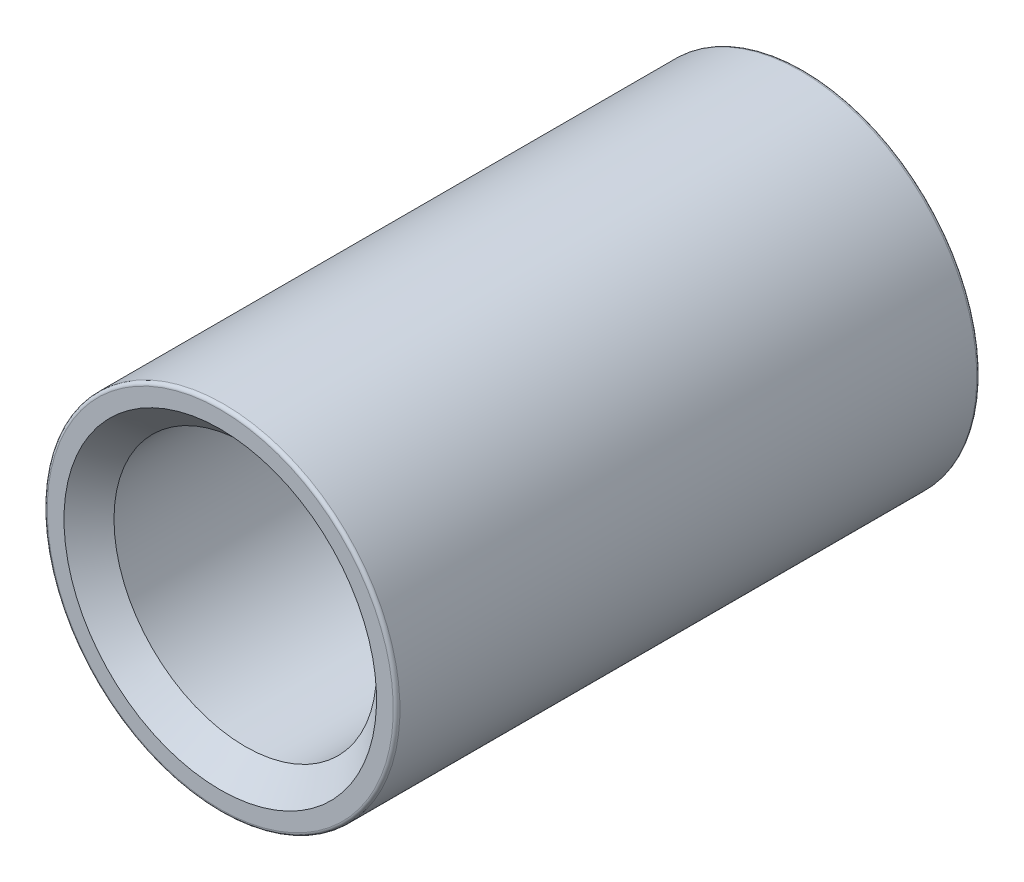
ISO-10303-21;
HEADER;
FILE_DESCRIPTION(('STEP AP214'),'2;1');
FILE_NAME('part.step','',(''),(''),'','','');
FILE_SCHEMA(('AUTOMOTIVE_DESIGN { 1 0 10303 214 1 1 1 1 }'));
ENDSEC;
DATA;
#1=APPLICATION_CONTEXT('core data for automotive mechanical design processes');
#2=APPLICATION_PROTOCOL_DEFINITION('international standard','automotive_design',2000,#1);
#3=PRODUCT_CONTEXT('',#1,'mechanical');
#4=PRODUCT('Part','Part','',(#3));
#5=PRODUCT_RELATED_PRODUCT_CATEGORY('part','',(#4));
#6=PRODUCT_DEFINITION_FORMATION('','',#4);
#7=PRODUCT_DEFINITION_CONTEXT('part definition',#1,'design');
#8=PRODUCT_DEFINITION('design','',#6,#7);
#9=PRODUCT_DEFINITION_SHAPE('','',#8);
#10=(LENGTH_UNIT() NAMED_UNIT(*) SI_UNIT(.MILLI.,.METRE.));
#11=(NAMED_UNIT(*) PLANE_ANGLE_UNIT() SI_UNIT($,.RADIAN.));
#12=(NAMED_UNIT(*) SI_UNIT($,.STERADIAN.) SOLID_ANGLE_UNIT());
#13=UNCERTAINTY_MEASURE_WITH_UNIT(LENGTH_MEASURE(1.E-05),#10,'distance_accuracy_value','');
#14=(GEOMETRIC_REPRESENTATION_CONTEXT(3) GLOBAL_UNCERTAINTY_ASSIGNED_CONTEXT((#13)) GLOBAL_UNIT_ASSIGNED_CONTEXT((#10,
#11,#12)) REPRESENTATION_CONTEXT('',''));
#15=CARTESIAN_POINT('',(0.,0.,0.));
#16=DIRECTION('',(0.,0.,1.));
#17=DIRECTION('',(1.,0.,0.));
#18=AXIS2_PLACEMENT_3D('',#15,#16,#17);
#19=CARTESIAN_POINT('',(0.,0.,-2.505));
#20=DIRECTION('',(0.,0.,-1.));
#21=DIRECTION('',(0.,1.,0.));
#22=AXIS2_PLACEMENT_3D('',#19,#20,#21);
#23=TOROIDAL_SURFACE('',#22,10.3791,0.2);
#24=CARTESIAN_POINT('',(0.,0.,-2.505));
#25=DIRECTION('',(0.,0.,-1.));
#26=DIRECTION('',(0.,1.,0.));
#27=AXIS2_PLACEMENT_3D('',#24,#25,#26);
#28=CIRCLE('',#27,10.5791);
#29=CARTESIAN_POINT('',(0.,10.5791,-2.505));
#30=VERTEX_POINT('',#29);
#31=EDGE_CURVE('E68',#30,#30,#28,.T.);
#32=ORIENTED_EDGE('',*,*,#31,.T.);
#33=EDGE_LOOP('',(#32));
#34=FACE_BOUND('',#33,.T.);
#35=CARTESIAN_POINT('',(0.,0.,-2.705));
#36=DIRECTION('',(0.,0.,-1.));
#37=DIRECTION('',(0.,1.,0.));
#38=AXIS2_PLACEMENT_3D('',#35,#36,#37);
#39=CIRCLE('',#38,10.3791);
#40=CARTESIAN_POINT('',(0.,10.3791,-2.705));
#41=VERTEX_POINT('',#40);
#42=EDGE_CURVE('E10',#41,#41,#39,.T.);
#43=ORIENTED_EDGE('',*,*,#42,.F.);
#44=EDGE_LOOP('',(#43));
#45=FACE_BOUND('',#44,.T.);
#46=ADVANCED_FACE('F37',(#34,#45),#23,.T.);
#47=CARTESIAN_POINT('',(0.,10.3791,-2.705));
#48=DIRECTION('',(0.,0.,-1.));
#49=DIRECTION('',(0.,1.,0.));
#50=AXIS2_PLACEMENT_3D('',#47,#48,#49);
#51=PLANE('',#50);
#52=ORIENTED_EDGE('',*,*,#42,.T.);
#53=EDGE_LOOP('',(#52));
#54=FACE_BOUND('',#53,.T.);
#55=ADVANCED_FACE('F87',(#54),#51,.T.);
#56=CARTESIAN_POINT('',(0.,0.,0.));
#57=DIRECTION('',(0.,0.,1.));
#58=DIRECTION('',(0.,-1.,0.));
#59=AXIS2_PLACEMENT_3D('',#56,#57,#58);
#60=PLANE('',#59);
#61=CARTESIAN_POINT('',(0.,0.,0.));
#62=DIRECTION('',(0.,0.,-1.));
#63=DIRECTION('',(0.,1.,0.));
#64=AXIS2_PLACEMENT_3D('',#61,#62,#63);
#65=CIRCLE('',#64,7.874);
#66=CARTESIAN_POINT('',(0.,7.874,0.));
#67=VERTEX_POINT('',#66);
#68=EDGE_CURVE('E44',#67,#67,#65,.T.);
#69=ORIENTED_EDGE('',*,*,#68,.F.);
#70=EDGE_LOOP('',(#69));
#71=FACE_BOUND('',#70,.T.);
#72=ADVANCED_FACE('F91',(#71),#60,.T.);
#73=CARTESIAN_POINT('',(0.,0.,-2.705));
#74=DIRECTION('',(0.,0.,-1.));
#75=DIRECTION('',(0.,1.,0.));
#76=AXIS2_PLACEMENT_3D('',#73,#74,#75);
#77=CYLINDRICAL_SURFACE('',#76,7.874);
#78=ORIENTED_EDGE('',*,*,#68,.T.);
#79=EDGE_LOOP('',(#78));
#80=FACE_BOUND('',#79,.T.);
#81=CARTESIAN_POINT('',(0.,0.,30.795));
#82=DIRECTION('',(0.,0.,-1.));
#83=DIRECTION('',(0.,1.,0.));
#84=AXIS2_PLACEMENT_3D('',#81,#82,#83);
#85=CIRCLE('',#84,7.87399999999999);
#86=CARTESIAN_POINT('',(0.,7.874,30.795));
#87=VERTEX_POINT('',#86);
#88=EDGE_CURVE('E49',#87,#87,#85,.T.);
#89=ORIENTED_EDGE('',*,*,#88,.F.);
#90=EDGE_LOOP('',(#89));
#91=FACE_BOUND('',#90,.T.);
#92=ADVANCED_FACE('F95',(#80,#91),#77,.F.);
#93=CARTESIAN_POINT('',(0.,0.,32.295));
#94=DIRECTION('',(0.,0.,1.));
#95=DIRECTION('',(0.,-1.,0.));
#96=AXIS2_PLACEMENT_3D('',#93,#94,#95);
#97=CONICAL_SURFACE('',#96,9.37399999999999,0.785398163397448);
#98=ORIENTED_EDGE('',*,*,#88,.T.);
#99=EDGE_LOOP('',(#98));
#100=FACE_BOUND('',#99,.T.);
#101=CARTESIAN_POINT('',(0.,0.,32.295));
#102=DIRECTION('',(0.,0.,-1.));
#103=DIRECTION('',(0.,1.,0.));
#104=AXIS2_PLACEMENT_3D('',#101,#102,#103);
#105=CIRCLE('',#104,9.37399999999999);
#106=CARTESIAN_POINT('',(0.,9.374,32.295));
#107=VERTEX_POINT('',#106);
#108=EDGE_CURVE('E54',#107,#107,#105,.T.);
#109=ORIENTED_EDGE('',*,*,#108,.F.);
#110=EDGE_LOOP('',(#109));
#111=FACE_BOUND('',#110,.T.);
#112=ADVANCED_FACE('F101',(#100,#111),#97,.F.);
#113=CARTESIAN_POINT('',(0.,9.374,32.295));
#114=DIRECTION('',(0.,0.,1.));
#115=DIRECTION('',(0.,-1.,0.));
#116=AXIS2_PLACEMENT_3D('',#113,#114,#115);
#117=PLANE('',#116);
#118=ORIENTED_EDGE('',*,*,#108,.T.);
#119=EDGE_LOOP('',(#118));
#120=FACE_BOUND('',#119,.T.);
#121=CARTESIAN_POINT('',(0.,0.,32.295));
#122=DIRECTION('',(0.,0.,-1.));
#123=DIRECTION('',(0.,1.,0.));
#124=AXIS2_PLACEMENT_3D('',#121,#122,#123);
#125=CIRCLE('',#124,10.3791);
#126=CARTESIAN_POINT('',(0.,10.3791,32.295));
#127=VERTEX_POINT('',#126);
#128=EDGE_CURVE('E60',#127,#127,#125,.T.);
#129=ORIENTED_EDGE('',*,*,#128,.F.);
#130=EDGE_LOOP('',(#129));
#131=FACE_BOUND('',#130,.T.);
#132=ADVANCED_FACE('F83',(#120,#131),#117,.T.);
#133=CARTESIAN_POINT('',(0.,0.,32.095));
#134=DIRECTION('',(0.,0.,-1.));
#135=DIRECTION('',(0.,1.,0.));
#136=AXIS2_PLACEMENT_3D('',#133,#134,#135);
#137=TOROIDAL_SURFACE('',#136,10.3791,0.200000000000001);
#138=ORIENTED_EDGE('',*,*,#128,.T.);
#139=EDGE_LOOP('',(#138));
#140=FACE_BOUND('',#139,.T.);
#141=CARTESIAN_POINT('',(0.,0.,32.095));
#142=DIRECTION('',(0.,0.,-1.));
#143=DIRECTION('',(0.,1.,0.));
#144=AXIS2_PLACEMENT_3D('',#141,#142,#143);
#145=CIRCLE('',#144,10.5791);
#146=CARTESIAN_POINT('',(0.,10.5791,32.095));
#147=VERTEX_POINT('',#146);
#148=EDGE_CURVE('E64',#147,#147,#145,.T.);
#149=ORIENTED_EDGE('',*,*,#148,.F.);
#150=EDGE_LOOP('',(#149));
#151=FACE_BOUND('',#150,.T.);
#152=ADVANCED_FACE('F77',(#140,#151),#137,.T.);
#153=CARTESIAN_POINT('',(0.,0.,-2.705));
#154=DIRECTION('',(0.,0.,-1.));
#155=DIRECTION('',(0.,1.,0.));
#156=AXIS2_PLACEMENT_3D('',#153,#154,#155);
#157=CYLINDRICAL_SURFACE('',#156,10.5791);
#158=ORIENTED_EDGE('',*,*,#148,.T.);
#159=EDGE_LOOP('',(#158));
#160=FACE_BOUND('',#159,.T.);
#161=ORIENTED_EDGE('',*,*,#31,.F.);
#162=EDGE_LOOP('',(#161));
#163=FACE_BOUND('',#162,.T.);
#164=ADVANCED_FACE('F75',(#160,#163),#157,.T.);
#165=CLOSED_SHELL('',(#46,#55,#72,#92,#112,#132,#152,#164));
#166=MANIFOLD_SOLID_BREP('B2',#165);
#167=ADVANCED_BREP_SHAPE_REPRESENTATION('',(#18,#166),#14);
#168=SHAPE_DEFINITION_REPRESENTATION(#9,#167);
ENDSEC;
END-ISO-10303-21;
